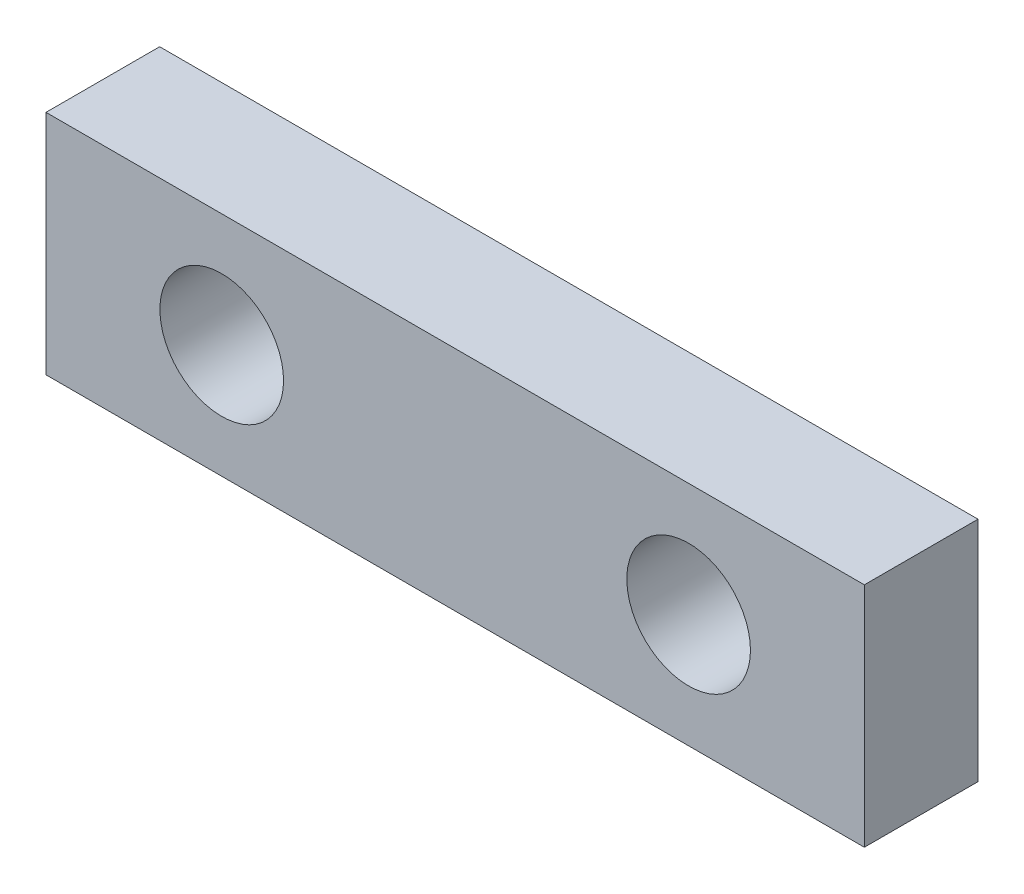
ISO-10303-21;
HEADER;
FILE_DESCRIPTION(('STEP AP214'),'2;1');
FILE_NAME('part.step','',(''),(''),'','','');
FILE_SCHEMA(('AUTOMOTIVE_DESIGN { 1 0 10303 214 1 1 1 1 }'));
ENDSEC;
DATA;
#1=APPLICATION_CONTEXT('core data for automotive mechanical design processes');
#2=APPLICATION_PROTOCOL_DEFINITION('international standard','automotive_design',2000,#1);
#3=PRODUCT_CONTEXT('',#1,'mechanical');
#4=PRODUCT('Part','Part','',(#3));
#5=PRODUCT_RELATED_PRODUCT_CATEGORY('part','',(#4));
#6=PRODUCT_DEFINITION_FORMATION('','',#4);
#7=PRODUCT_DEFINITION_CONTEXT('part definition',#1,'design');
#8=PRODUCT_DEFINITION('design','',#6,#7);
#9=PRODUCT_DEFINITION_SHAPE('','',#8);
#10=(LENGTH_UNIT() NAMED_UNIT(*) SI_UNIT(.MILLI.,.METRE.));
#11=(NAMED_UNIT(*) PLANE_ANGLE_UNIT() SI_UNIT($,.RADIAN.));
#12=(NAMED_UNIT(*) SI_UNIT($,.STERADIAN.) SOLID_ANGLE_UNIT());
#13=UNCERTAINTY_MEASURE_WITH_UNIT(LENGTH_MEASURE(1.E-05),#10,'distance_accuracy_value','');
#14=(GEOMETRIC_REPRESENTATION_CONTEXT(3) GLOBAL_UNCERTAINTY_ASSIGNED_CONTEXT((#13)) GLOBAL_UNIT_ASSIGNED_CONTEXT((#10,
#11,#12)) REPRESENTATION_CONTEXT('',''));
#15=CARTESIAN_POINT('',(0.,0.,0.));
#16=DIRECTION('',(0.,0.,1.));
#17=DIRECTION('',(1.,0.,0.));
#18=AXIS2_PLACEMENT_3D('',#15,#16,#17);
#19=CARTESIAN_POINT('',(11.43,-3.175,3.175));
#20=DIRECTION('',(-1.,0.,0.));
#21=DIRECTION('',(0.,0.,1.));
#22=AXIS2_PLACEMENT_3D('',#19,#20,#21);
#23=PLANE('',#22);
#24=DIRECTION('',(0.,1.,0.));
#25=VECTOR('',#24,1.);
#26=CARTESIAN_POINT('',(11.43,-3.175,0.));
#27=LINE('',#26,#25);
#28=CARTESIAN_POINT('',(11.43,-3.175,0.));
#29=VERTEX_POINT('',#28);
#30=CARTESIAN_POINT('',(11.43,3.175,0.));
#31=VERTEX_POINT('',#30);
#32=EDGE_CURVE('E97',#29,#31,#27,.T.);
#33=ORIENTED_EDGE('',*,*,#32,.T.);
#34=DIRECTION('',(0.,0.,-1.));
#35=VECTOR('',#34,1.);
#36=CARTESIAN_POINT('',(11.43,3.175,3.175));
#37=LINE('',#36,#35);
#38=CARTESIAN_POINT('',(11.43,3.175,3.175));
#39=VERTEX_POINT('',#38);
#40=EDGE_CURVE('E11',#39,#31,#37,.T.);
#41=ORIENTED_EDGE('',*,*,#40,.F.);
#42=DIRECTION('',(0.,1.,0.));
#43=VECTOR('',#42,1.);
#44=CARTESIAN_POINT('',(11.43,-3.175,3.175));
#45=LINE('',#44,#43);
#46=CARTESIAN_POINT('',(11.43,-3.175,3.175));
#47=VERTEX_POINT('',#46);
#48=EDGE_CURVE('E85',#47,#39,#45,.T.);
#49=ORIENTED_EDGE('',*,*,#48,.F.);
#50=DIRECTION('',(0.,0.,-1.));
#51=VECTOR('',#50,1.);
#52=CARTESIAN_POINT('',(11.43,-3.175,3.175));
#53=LINE('',#52,#51);
#54=EDGE_CURVE('E93',#47,#29,#53,.T.);
#55=ORIENTED_EDGE('',*,*,#54,.T.);
#56=EDGE_LOOP('',(#33,#41,#49,#55));
#57=FACE_BOUND('',#56,.T.);
#58=ADVANCED_FACE('F34',(#57),#23,.F.);
#59=CARTESIAN_POINT('',(-11.43,3.175,3.175));
#60=DIRECTION('',(0.,-1.,0.));
#61=DIRECTION('',(0.,0.,-1.));
#62=AXIS2_PLACEMENT_3D('',#59,#60,#61);
#63=PLANE('',#62);
#64=DIRECTION('',(-1.,0.,0.));
#65=VECTOR('',#64,1.);
#66=CARTESIAN_POINT('',(-11.43,3.175,0.));
#67=LINE('',#66,#65);
#68=CARTESIAN_POINT('',(-11.43,3.175,0.));
#69=VERTEX_POINT('',#68);
#70=EDGE_CURVE('E89',#31,#69,#67,.T.);
#71=ORIENTED_EDGE('',*,*,#70,.T.);
#72=DIRECTION('',(0.,0.,-1.));
#73=VECTOR('',#72,1.);
#74=CARTESIAN_POINT('',(-11.43,3.175,3.175));
#75=LINE('',#74,#73);
#76=CARTESIAN_POINT('',(-11.43,3.175,3.175));
#77=VERTEX_POINT('',#76);
#78=EDGE_CURVE('E42',#77,#69,#75,.T.);
#79=ORIENTED_EDGE('',*,*,#78,.F.);
#80=DIRECTION('',(-1.,0.,0.));
#81=VECTOR('',#80,1.);
#82=CARTESIAN_POINT('',(-11.43,3.175,3.175));
#83=LINE('',#82,#81);
#84=EDGE_CURVE('E80',#39,#77,#83,.T.);
#85=ORIENTED_EDGE('',*,*,#84,.F.);
#86=ORIENTED_EDGE('',*,*,#40,.T.);
#87=EDGE_LOOP('',(#71,#79,#85,#86));
#88=FACE_BOUND('',#87,.T.);
#89=ADVANCED_FACE('F88',(#88),#63,.F.);
#90=CARTESIAN_POINT('',(-11.43,-3.175,3.175));
#91=DIRECTION('',(1.,0.,0.));
#92=DIRECTION('',(0.,0.,-1.));
#93=AXIS2_PLACEMENT_3D('',#90,#91,#92);
#94=PLANE('',#93);
#95=DIRECTION('',(0.,-1.,0.));
#96=VECTOR('',#95,1.);
#97=CARTESIAN_POINT('',(-11.43,-3.175,0.));
#98=LINE('',#97,#96);
#99=CARTESIAN_POINT('',(-11.43,-3.175,0.));
#100=VERTEX_POINT('',#99);
#101=EDGE_CURVE('E67',#69,#100,#98,.T.);
#102=ORIENTED_EDGE('',*,*,#101,.T.);
#103=DIRECTION('',(0.,0.,-1.));
#104=VECTOR('',#103,1.);
#105=CARTESIAN_POINT('',(-11.43,-3.175,3.175));
#106=LINE('',#105,#104);
#107=CARTESIAN_POINT('',(-11.43,-3.175,3.175));
#108=VERTEX_POINT('',#107);
#109=EDGE_CURVE('E90',#108,#100,#106,.T.);
#110=ORIENTED_EDGE('',*,*,#109,.F.);
#111=DIRECTION('',(0.,-1.,0.));
#112=VECTOR('',#111,1.);
#113=CARTESIAN_POINT('',(-11.43,-3.175,3.175));
#114=LINE('',#113,#112);
#115=EDGE_CURVE('E83',#77,#108,#114,.T.);
#116=ORIENTED_EDGE('',*,*,#115,.F.);
#117=ORIENTED_EDGE('',*,*,#78,.T.);
#118=EDGE_LOOP('',(#102,#110,#116,#117));
#119=FACE_BOUND('',#118,.T.);
#120=ADVANCED_FACE('F91',(#119),#94,.F.);
#121=CARTESIAN_POINT('',(-11.43,-3.175,3.175));
#122=DIRECTION('',(0.,1.,0.));
#123=DIRECTION('',(0.,0.,1.));
#124=AXIS2_PLACEMENT_3D('',#121,#122,#123);
#125=PLANE('',#124);
#126=DIRECTION('',(1.,0.,0.));
#127=VECTOR('',#126,1.);
#128=CARTESIAN_POINT('',(-11.43,-3.175,0.));
#129=LINE('',#128,#127);
#130=EDGE_CURVE('E73',#100,#29,#129,.T.);
#131=ORIENTED_EDGE('',*,*,#130,.T.);
#132=ORIENTED_EDGE('',*,*,#54,.F.);
#133=DIRECTION('',(1.,0.,0.));
#134=VECTOR('',#133,1.);
#135=CARTESIAN_POINT('',(-11.43,-3.175,3.175));
#136=LINE('',#135,#134);
#137=EDGE_CURVE('E50',#108,#47,#136,.T.);
#138=ORIENTED_EDGE('',*,*,#137,.F.);
#139=ORIENTED_EDGE('',*,*,#109,.T.);
#140=EDGE_LOOP('',(#131,#132,#138,#139));
#141=FACE_BOUND('',#140,.T.);
#142=ADVANCED_FACE('F105',(#141),#125,.F.);
#143=CARTESIAN_POINT('',(11.43,3.175,3.175));
#144=DIRECTION('',(0.,0.,-1.));
#145=DIRECTION('',(-1.,0.,0.));
#146=AXIS2_PLACEMENT_3D('',#143,#144,#145);
#147=PLANE('',#146);
#148=CARTESIAN_POINT('',(-6.52145,0.,3.175));
#149=DIRECTION('',(0.,0.,1.));
#150=DIRECTION('',(1.,0.,0.));
#151=AXIS2_PLACEMENT_3D('',#148,#149,#150);
#152=CIRCLE('',#151,1.72719999999999);
#153=CARTESIAN_POINT('',(-4.79425000000001,0.,3.175));
#154=VERTEX_POINT('',#153);
#155=EDGE_CURVE('E119',#154,#154,#152,.T.);
#156=ORIENTED_EDGE('',*,*,#155,.F.);
#157=EDGE_LOOP('',(#156));
#158=FACE_BOUND('',#157,.T.);
#159=CARTESIAN_POINT('',(6.52145,0.,3.175));
#160=DIRECTION('',(0.,0.,1.));
#161=DIRECTION('',(1.,0.,0.));
#162=AXIS2_PLACEMENT_3D('',#159,#160,#161);
#163=CIRCLE('',#162,1.72719999999999);
#164=CARTESIAN_POINT('',(8.24864999999999,0.,3.175));
#165=VERTEX_POINT('',#164);
#166=EDGE_CURVE('E113',#165,#165,#163,.T.);
#167=ORIENTED_EDGE('',*,*,#166,.F.);
#168=EDGE_LOOP('',(#167));
#169=FACE_BOUND('',#168,.T.);
#170=ORIENTED_EDGE('',*,*,#48,.T.);
#171=ORIENTED_EDGE('',*,*,#84,.T.);
#172=ORIENTED_EDGE('',*,*,#115,.T.);
#173=ORIENTED_EDGE('',*,*,#137,.T.);
#174=EDGE_LOOP('',(#170,#171,#172,#173));
#175=FACE_BOUND('',#174,.T.);
#176=ADVANCED_FACE('F81',(#158,#169,#175),#147,.F.);
#177=CARTESIAN_POINT('',(11.43,3.175,0.));
#178=DIRECTION('',(0.,0.,-1.));
#179=DIRECTION('',(-1.,0.,0.));
#180=AXIS2_PLACEMENT_3D('',#177,#178,#179);
#181=PLANE('',#180);
#182=CARTESIAN_POINT('',(-6.52145,0.,0.));
#183=DIRECTION('',(0.,0.,1.));
#184=DIRECTION('',(1.,0.,0.));
#185=AXIS2_PLACEMENT_3D('',#182,#183,#184);
#186=CIRCLE('',#185,1.7272);
#187=CARTESIAN_POINT('',(-4.79425,0.,0.));
#188=VERTEX_POINT('',#187);
#189=EDGE_CURVE('E116',#188,#188,#186,.T.);
#190=ORIENTED_EDGE('',*,*,#189,.T.);
#191=EDGE_LOOP('',(#190));
#192=FACE_BOUND('',#191,.T.);
#193=CARTESIAN_POINT('',(6.52145,0.,0.));
#194=DIRECTION('',(0.,0.,1.));
#195=DIRECTION('',(1.,0.,0.));
#196=AXIS2_PLACEMENT_3D('',#193,#194,#195);
#197=CIRCLE('',#196,1.7272);
#198=CARTESIAN_POINT('',(8.24865,0.,0.));
#199=VERTEX_POINT('',#198);
#200=EDGE_CURVE('E100',#199,#199,#197,.T.);
#201=ORIENTED_EDGE('',*,*,#200,.T.);
#202=EDGE_LOOP('',(#201));
#203=FACE_BOUND('',#202,.T.);
#204=ORIENTED_EDGE('',*,*,#32,.F.);
#205=ORIENTED_EDGE('',*,*,#130,.F.);
#206=ORIENTED_EDGE('',*,*,#101,.F.);
#207=ORIENTED_EDGE('',*,*,#70,.F.);
#208=EDGE_LOOP('',(#204,#205,#206,#207));
#209=FACE_BOUND('',#208,.T.);
#210=ADVANCED_FACE('F108',(#192,#203,#209),#181,.T.);
#211=CARTESIAN_POINT('',(6.52145,0.,3.175));
#212=DIRECTION('',(0.,0.,1.));
#213=DIRECTION('',(1.,0.,0.));
#214=AXIS2_PLACEMENT_3D('',#211,#212,#213);
#215=CYLINDRICAL_SURFACE('',#214,1.72719999999999);
#216=ORIENTED_EDGE('',*,*,#200,.F.);
#217=EDGE_LOOP('',(#216));
#218=FACE_BOUND('',#217,.T.);
#219=ORIENTED_EDGE('',*,*,#166,.T.);
#220=EDGE_LOOP('',(#219));
#221=FACE_BOUND('',#220,.T.);
#222=ADVANCED_FACE('F130',(#218,#221),#215,.F.);
#223=CARTESIAN_POINT('',(-6.52145,0.,3.175));
#224=DIRECTION('',(0.,0.,1.));
#225=DIRECTION('',(1.,0.,0.));
#226=AXIS2_PLACEMENT_3D('',#223,#224,#225);
#227=CYLINDRICAL_SURFACE('',#226,1.72719999999999);
#228=ORIENTED_EDGE('',*,*,#189,.F.);
#229=EDGE_LOOP('',(#228));
#230=FACE_BOUND('',#229,.T.);
#231=ORIENTED_EDGE('',*,*,#155,.T.);
#232=EDGE_LOOP('',(#231));
#233=FACE_BOUND('',#232,.T.);
#234=ADVANCED_FACE('F123',(#230,#233),#227,.F.);
#235=CLOSED_SHELL('',(#58,#89,#120,#142,#176,#210,#222,#234));
#236=MANIFOLD_SOLID_BREP('B2',#235);
#237=ADVANCED_BREP_SHAPE_REPRESENTATION('',(#18,#236),#14);
#238=SHAPE_DEFINITION_REPRESENTATION(#9,#237);
ENDSEC;
END-ISO-10303-21;
